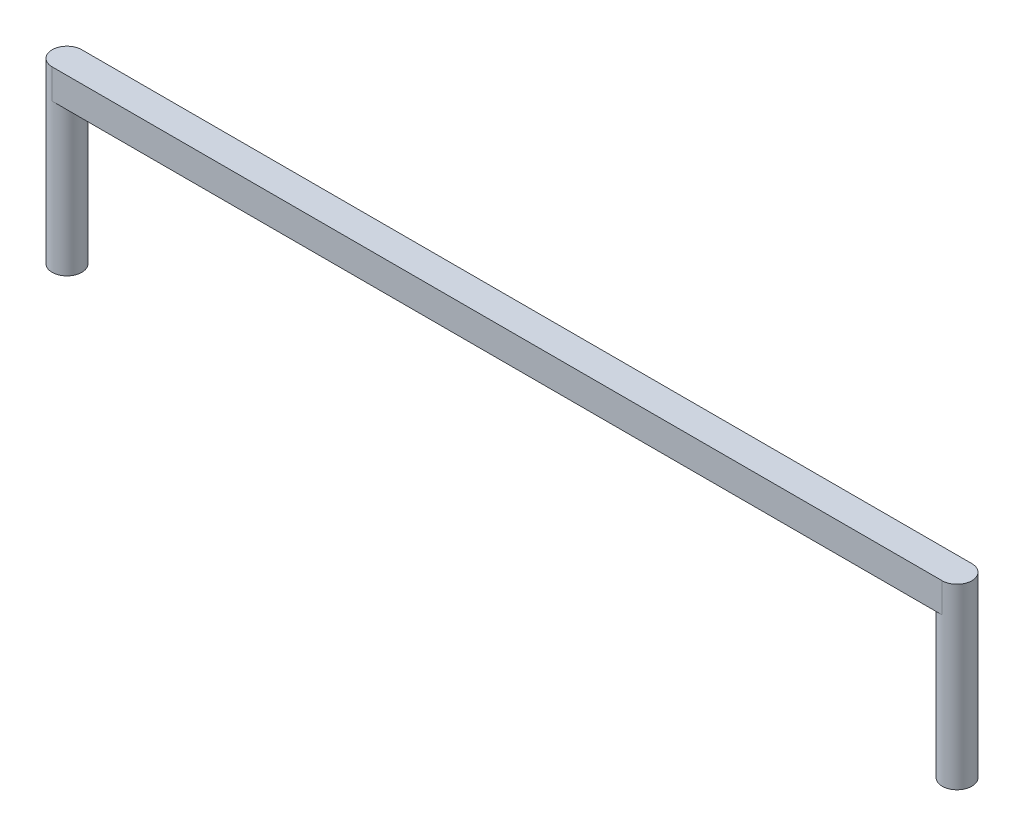
ISO-10303-21;
HEADER;
FILE_DESCRIPTION(('STEP AP214'),'2;1');
FILE_NAME('part.step','',(''),(''),'','','');
FILE_SCHEMA(('AUTOMOTIVE_DESIGN { 1 0 10303 214 1 1 1 1 }'));
ENDSEC;
DATA;
#1=APPLICATION_CONTEXT('core data for automotive mechanical design processes');
#2=APPLICATION_PROTOCOL_DEFINITION('international standard','automotive_design',2000,#1);
#3=PRODUCT_CONTEXT('',#1,'mechanical');
#4=PRODUCT('Part','Part','',(#3));
#5=PRODUCT_RELATED_PRODUCT_CATEGORY('part','',(#4));
#6=PRODUCT_DEFINITION_FORMATION('','',#4);
#7=PRODUCT_DEFINITION_CONTEXT('part definition',#1,'design');
#8=PRODUCT_DEFINITION('design','',#6,#7);
#9=PRODUCT_DEFINITION_SHAPE('','',#8);
#10=(LENGTH_UNIT() NAMED_UNIT(*) SI_UNIT(.MILLI.,.METRE.));
#11=(NAMED_UNIT(*) PLANE_ANGLE_UNIT() SI_UNIT($,.RADIAN.));
#12=(NAMED_UNIT(*) SI_UNIT($,.STERADIAN.) SOLID_ANGLE_UNIT());
#13=UNCERTAINTY_MEASURE_WITH_UNIT(LENGTH_MEASURE(1.E-05),#10,'distance_accuracy_value','');
#14=(GEOMETRIC_REPRESENTATION_CONTEXT(3) GLOBAL_UNCERTAINTY_ASSIGNED_CONTEXT((#13)) GLOBAL_UNIT_ASSIGNED_CONTEXT((#10,
#11,#12)) REPRESENTATION_CONTEXT('',''));
#15=CARTESIAN_POINT('',(0.,0.,0.));
#16=DIRECTION('',(0.,0.,1.));
#17=DIRECTION('',(1.,0.,0.));
#18=AXIS2_PLACEMENT_3D('',#15,#16,#17);
#19=CARTESIAN_POINT('',(44.606081270439,-11.6550181917129,34.4647061808321));
#20=DIRECTION('',(0.,-1.,0.));
#21=DIRECTION('',(0.,0.,-1.));
#22=AXIS2_PLACEMENT_3D('',#19,#20,#21);
#23=CYLINDRICAL_SURFACE('',#22,0.999999999999984);
#24=DIRECTION('',(0.,-1.,0.));
#25=VECTOR('',#24,1.);
#26=CARTESIAN_POINT('',(44.606081270439,-11.6550181917129,35.4647061808321));
#27=LINE('',#26,#25);
#28=CARTESIAN_POINT('',(44.606081270439,-11.6550181917129,35.4647061808321));
#29=VERTEX_POINT('',#28);
#30=CARTESIAN_POINT('',(44.606081270439,-13.6550181917129,35.4647061808321));
#31=VERTEX_POINT('',#30);
#32=EDGE_CURVE('E55',#29,#31,#27,.T.);
#33=ORIENTED_EDGE('',*,*,#32,.T.);
#34=CARTESIAN_POINT('',(44.606081270439,-13.6550181917129,34.4647061808321));
#35=DIRECTION('',(0.,1.,0.));
#36=DIRECTION('',(0.,0.,1.));
#37=AXIS2_PLACEMENT_3D('',#34,#35,#36);
#38=CIRCLE('',#37,0.99999999999998);
#39=CARTESIAN_POINT('',(44.606081270439,-13.6550181917129,33.4647061808321));
#40=VERTEX_POINT('',#39);
#41=EDGE_CURVE('E11',#40,#31,#38,.T.);
#42=ORIENTED_EDGE('',*,*,#41,.F.);
#43=DIRECTION('',(0.,-1.,0.));
#44=VECTOR('',#43,1.);
#45=CARTESIAN_POINT('',(44.606081270439,-11.6550181917129,33.4647061808321));
#46=LINE('',#45,#44);
#47=CARTESIAN_POINT('',(44.606081270439,-11.6550181917129,33.4647061808321));
#48=VERTEX_POINT('',#47);
#49=EDGE_CURVE('E90',#48,#40,#46,.T.);
#50=ORIENTED_EDGE('',*,*,#49,.F.);
#51=CARTESIAN_POINT('',(44.606081270439,-11.6550181917129,34.4647061808321));
#52=DIRECTION('',(0.,1.,0.));
#53=DIRECTION('',(0.,0.,1.));
#54=AXIS2_PLACEMENT_3D('',#51,#52,#53);
#55=CIRCLE('',#54,0.999999999999984);
#56=EDGE_CURVE('E101',#29,#48,#55,.T.);
#57=ORIENTED_EDGE('',*,*,#56,.F.);
#58=EDGE_LOOP('',(#33,#42,#50,#57));
#59=FACE_BOUND('',#58,.T.);
#60=CARTESIAN_POINT('',(44.606081270439,-23.6550181917129,34.4647061808321));
#61=DIRECTION('',(0.,1.,0.));
#62=DIRECTION('',(0.,0.,1.));
#63=AXIS2_PLACEMENT_3D('',#60,#61,#62);
#64=CIRCLE('',#63,0.99999999999998);
#65=CARTESIAN_POINT('',(44.606081270439,-23.6550181917129,35.4647061808321));
#66=VERTEX_POINT('',#65);
#67=EDGE_CURVE('E109',#66,#66,#64,.T.);
#68=ORIENTED_EDGE('',*,*,#67,.T.);
#69=EDGE_LOOP('',(#68));
#70=FACE_BOUND('',#69,.T.);
#71=ADVANCED_FACE('F39',(#59,#70),#23,.T.);
#72=CARTESIAN_POINT('',(-15.393918729561,-11.6550181917129,33.4647061808321));
#73=DIRECTION('',(0.,0.,-1.));
#74=DIRECTION('',(-1.,0.,0.));
#75=AXIS2_PLACEMENT_3D('',#72,#73,#74);
#76=PLANE('',#75);
#77=DIRECTION('',(1.,0.,0.));
#78=VECTOR('',#77,1.);
#79=CARTESIAN_POINT('',(-15.393918729561,-13.6550181917129,33.4647061808321));
#80=LINE('',#79,#78);
#81=CARTESIAN_POINT('',(-15.393918729561,-13.6550181917129,33.4647061808321));
#82=VERTEX_POINT('',#81);
#83=EDGE_CURVE('E89',#82,#40,#80,.T.);
#84=ORIENTED_EDGE('',*,*,#83,.F.);
#85=DIRECTION('',(0.,-1.,0.));
#86=VECTOR('',#85,1.);
#87=CARTESIAN_POINT('',(-15.393918729561,-11.6550181917129,33.4647061808321));
#88=LINE('',#87,#86);
#89=CARTESIAN_POINT('',(-15.393918729561,-11.6550181917129,33.4647061808321));
#90=VERTEX_POINT('',#89);
#91=EDGE_CURVE('E83',#90,#82,#88,.T.);
#92=ORIENTED_EDGE('',*,*,#91,.F.);
#93=DIRECTION('',(1.,0.,0.));
#94=VECTOR('',#93,1.);
#95=CARTESIAN_POINT('',(-15.393918729561,-11.6550181917129,33.4647061808321));
#96=LINE('',#95,#94);
#97=EDGE_CURVE('E87',#90,#48,#96,.T.);
#98=ORIENTED_EDGE('',*,*,#97,.T.);
#99=ORIENTED_EDGE('',*,*,#49,.T.);
#100=EDGE_LOOP('',(#84,#92,#98,#99));
#101=FACE_BOUND('',#100,.T.);
#102=ADVANCED_FACE('F85',(#101),#76,.T.);
#103=CARTESIAN_POINT('',(-15.393918729561,-11.6550181917129,34.4647061808321));
#104=DIRECTION('',(0.,-1.,0.));
#105=DIRECTION('',(0.,0.,-1.));
#106=AXIS2_PLACEMENT_3D('',#103,#104,#105);
#107=CYLINDRICAL_SURFACE('',#106,1.);
#108=ORIENTED_EDGE('',*,*,#91,.T.);
#109=CARTESIAN_POINT('',(-15.393918729561,-13.6550181917129,34.4647061808321));
#110=DIRECTION('',(0.,1.,0.));
#111=DIRECTION('',(0.,0.,1.));
#112=AXIS2_PLACEMENT_3D('',#109,#110,#111);
#113=CIRCLE('',#112,1.);
#114=CARTESIAN_POINT('',(-15.393918729561,-13.6550181917129,35.4647061808321));
#115=VERTEX_POINT('',#114);
#116=EDGE_CURVE('E47',#115,#82,#113,.T.);
#117=ORIENTED_EDGE('',*,*,#116,.F.);
#118=DIRECTION('',(0.,-1.,0.));
#119=VECTOR('',#118,1.);
#120=CARTESIAN_POINT('',(-15.393918729561,-11.6550181917129,35.4647061808321));
#121=LINE('',#120,#119);
#122=CARTESIAN_POINT('',(-15.393918729561,-11.6550181917129,35.4647061808321));
#123=VERTEX_POINT('',#122);
#124=EDGE_CURVE('E91',#123,#115,#121,.T.);
#125=ORIENTED_EDGE('',*,*,#124,.F.);
#126=CARTESIAN_POINT('',(-15.393918729561,-11.6550181917129,34.4647061808321));
#127=DIRECTION('',(0.,1.,0.));
#128=DIRECTION('',(0.,0.,1.));
#129=AXIS2_PLACEMENT_3D('',#126,#127,#128);
#130=CIRCLE('',#129,1.);
#131=EDGE_CURVE('E93',#90,#123,#130,.T.);
#132=ORIENTED_EDGE('',*,*,#131,.F.);
#133=EDGE_LOOP('',(#108,#117,#125,#132));
#134=FACE_BOUND('',#133,.T.);
#135=CARTESIAN_POINT('',(-15.393918729561,-23.6550181917129,34.4647061808321));
#136=DIRECTION('',(0.,1.,0.));
#137=DIRECTION('',(0.,0.,1.));
#138=AXIS2_PLACEMENT_3D('',#135,#136,#137);
#139=CIRCLE('',#138,1.);
#140=CARTESIAN_POINT('',(-15.393918729561,-23.6550181917129,35.4647061808321));
#141=VERTEX_POINT('',#140);
#142=EDGE_CURVE('E134',#141,#141,#139,.T.);
#143=ORIENTED_EDGE('',*,*,#142,.T.);
#144=EDGE_LOOP('',(#143));
#145=FACE_BOUND('',#144,.T.);
#146=ADVANCED_FACE('F94',(#134,#145),#107,.T.);
#147=CARTESIAN_POINT('',(44.606081270439,-11.6550181917129,35.4647061808321));
#148=DIRECTION('',(0.,0.,1.));
#149=DIRECTION('',(1.,0.,0.));
#150=AXIS2_PLACEMENT_3D('',#147,#148,#149);
#151=PLANE('',#150);
#152=DIRECTION('',(-1.,0.,0.));
#153=VECTOR('',#152,1.);
#154=CARTESIAN_POINT('',(44.606081270439,-13.6550181917129,35.4647061808321));
#155=LINE('',#154,#153);
#156=EDGE_CURVE('E103',#31,#115,#155,.T.);
#157=ORIENTED_EDGE('',*,*,#156,.F.);
#158=ORIENTED_EDGE('',*,*,#32,.F.);
#159=DIRECTION('',(-1.,0.,0.));
#160=VECTOR('',#159,1.);
#161=CARTESIAN_POINT('',(44.606081270439,-11.6550181917129,35.4647061808321));
#162=LINE('',#161,#160);
#163=EDGE_CURVE('E98',#29,#123,#162,.T.);
#164=ORIENTED_EDGE('',*,*,#163,.T.);
#165=ORIENTED_EDGE('',*,*,#124,.T.);
#166=EDGE_LOOP('',(#157,#158,#164,#165));
#167=FACE_BOUND('',#166,.T.);
#168=ADVANCED_FACE('F116',(#167),#151,.T.);
#169=CARTESIAN_POINT('',(44.606081270439,-11.6550181917129,34.4647061808321));
#170=DIRECTION('',(0.,1.,0.));
#171=DIRECTION('',(0.,0.,1.));
#172=AXIS2_PLACEMENT_3D('',#169,#170,#171);
#173=PLANE('',#172);
#174=ORIENTED_EDGE('',*,*,#163,.F.);
#175=ORIENTED_EDGE('',*,*,#56,.T.);
#176=ORIENTED_EDGE('',*,*,#97,.F.);
#177=ORIENTED_EDGE('',*,*,#131,.T.);
#178=EDGE_LOOP('',(#174,#175,#176,#177));
#179=FACE_BOUND('',#178,.T.);
#180=ADVANCED_FACE('F100',(#179),#173,.T.);
#181=CARTESIAN_POINT('',(44.606081270439,-13.6550181917129,34.4647061808321));
#182=DIRECTION('',(0.,1.,0.));
#183=DIRECTION('',(0.,0.,1.));
#184=AXIS2_PLACEMENT_3D('',#181,#182,#183);
#185=PLANE('',#184);
#186=ORIENTED_EDGE('',*,*,#83,.T.);
#187=ORIENTED_EDGE('',*,*,#41,.T.);
#188=ORIENTED_EDGE('',*,*,#156,.T.);
#189=ORIENTED_EDGE('',*,*,#116,.T.);
#190=EDGE_LOOP('',(#186,#187,#188,#189));
#191=FACE_BOUND('',#190,.T.);
#192=ADVANCED_FACE('F115',(#191),#185,.F.);
#193=CARTESIAN_POINT('',(-15.393918729561,-23.6550181917129,34.4647061808321));
#194=DIRECTION('',(0.,1.,0.));
#195=DIRECTION('',(0.,0.,1.));
#196=AXIS2_PLACEMENT_3D('',#193,#194,#195);
#197=PLANE('',#196);
#198=ORIENTED_EDGE('',*,*,#142,.F.);
#199=EDGE_LOOP('',(#198));
#200=FACE_BOUND('',#199,.T.);
#201=ADVANCED_FACE('F139',(#200),#197,.F.);
#202=CARTESIAN_POINT('',(44.606081270439,-23.6550181917129,34.4647061808321));
#203=DIRECTION('',(0.,1.,0.));
#204=DIRECTION('',(0.,0.,1.));
#205=AXIS2_PLACEMENT_3D('',#202,#203,#204);
#206=PLANE('',#205);
#207=ORIENTED_EDGE('',*,*,#67,.F.);
#208=EDGE_LOOP('',(#207));
#209=FACE_BOUND('',#208,.T.);
#210=ADVANCED_FACE('F141',(#209),#206,.F.);
#211=CLOSED_SHELL('',(#71,#102,#146,#168,#180,#192,#201,#210));
#212=MANIFOLD_SOLID_BREP('B2',#211);
#213=ADVANCED_BREP_SHAPE_REPRESENTATION('',(#18,#212),#14);
#214=SHAPE_DEFINITION_REPRESENTATION(#9,#213);
ENDSEC;
END-ISO-10303-21;
